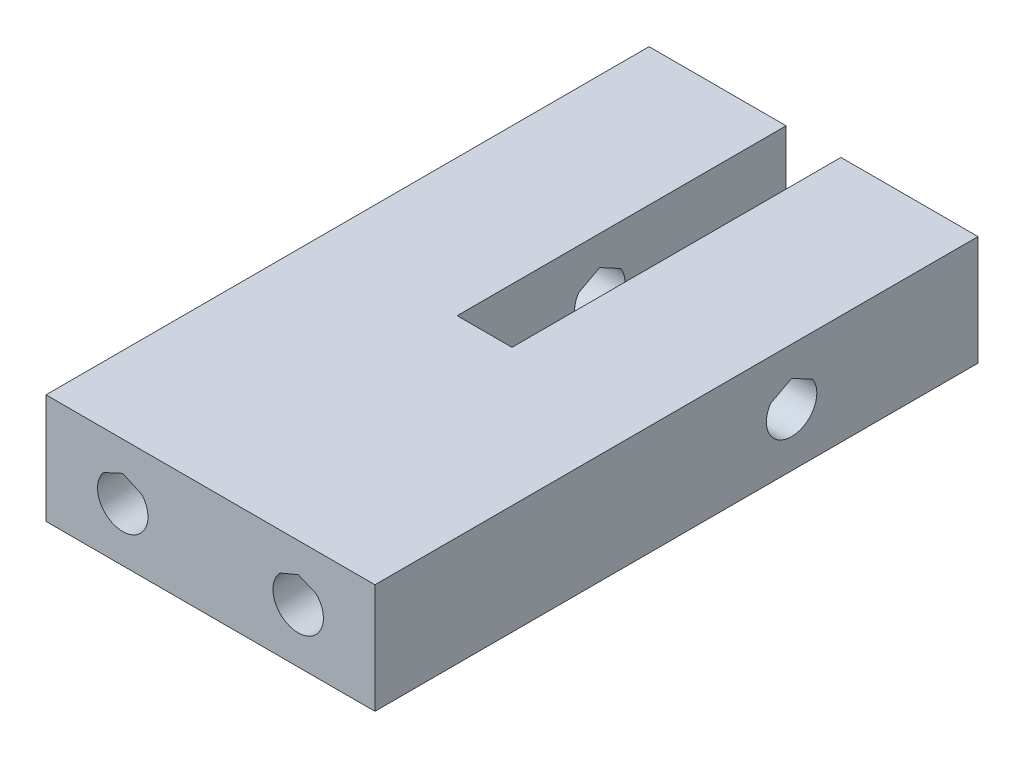
ISO-10303-21;
HEADER;
FILE_DESCRIPTION(('STEP AP214'),'2;1');
FILE_NAME('part.step','',(''),(''),'','','');
FILE_SCHEMA(('AUTOMOTIVE_DESIGN { 1 0 10303 214 1 1 1 1 }'));
ENDSEC;
DATA;
#1=APPLICATION_CONTEXT('core data for automotive mechanical design processes');
#2=APPLICATION_PROTOCOL_DEFINITION('international standard','automotive_design',2000,#1);
#3=PRODUCT_CONTEXT('',#1,'mechanical');
#4=PRODUCT('Part','Part','',(#3));
#5=PRODUCT_RELATED_PRODUCT_CATEGORY('part','',(#4));
#6=PRODUCT_DEFINITION_FORMATION('','',#4);
#7=PRODUCT_DEFINITION_CONTEXT('part definition',#1,'design');
#8=PRODUCT_DEFINITION('design','',#6,#7);
#9=PRODUCT_DEFINITION_SHAPE('','',#8);
#10=(LENGTH_UNIT() NAMED_UNIT(*) SI_UNIT(.MILLI.,.METRE.));
#11=(NAMED_UNIT(*) PLANE_ANGLE_UNIT() SI_UNIT($,.RADIAN.));
#12=(NAMED_UNIT(*) SI_UNIT($,.STERADIAN.) SOLID_ANGLE_UNIT());
#13=UNCERTAINTY_MEASURE_WITH_UNIT(LENGTH_MEASURE(1.E-05),#10,'distance_accuracy_value','');
#14=(GEOMETRIC_REPRESENTATION_CONTEXT(3) GLOBAL_UNCERTAINTY_ASSIGNED_CONTEXT((#13)) GLOBAL_UNIT_ASSIGNED_CONTEXT((#10,
#11,#12)) REPRESENTATION_CONTEXT('',''));
#15=CARTESIAN_POINT('',(0.,0.,0.));
#16=DIRECTION('',(0.,0.,1.));
#17=DIRECTION('',(1.,0.,0.));
#18=AXIS2_PLACEMENT_3D('',#15,#16,#17);
#19=CARTESIAN_POINT('',(-15.,10.,-27.5));
#20=DIRECTION('',(0.,0.,1.));
#21=DIRECTION('',(1.,0.,0.));
#22=AXIS2_PLACEMENT_3D('',#19,#20,#21);
#23=PLANE('',#22);
#24=DIRECTION('',(0.921369324591553,-0.388688265454085,0.));
#25=VECTOR('',#24,1.);
#26=CARTESIAN_POINT('',(8.,7.3,-27.5));
#27=LINE('',#26,#25);
#28=CARTESIAN_POINT('',(8.,7.3,-27.5));
#29=VERTEX_POINT('',#28);
#30=CARTESIAN_POINT('',(9.64737704524323,6.60503858857216,-27.5));
#31=VERTEX_POINT('',#30);
#32=EDGE_CURVE('E372',#29,#31,#27,.T.);
#33=ORIENTED_EDGE('',*,*,#32,.F.);
#34=DIRECTION('',(0.921369324591553,0.388688265454085,0.));
#35=VECTOR('',#34,1.);
#36=CARTESIAN_POINT('',(8.,7.3,-27.5));
#37=LINE('',#36,#35);
#38=CARTESIAN_POINT('',(6.35262295475678,6.60503858857216,-27.5));
#39=VERTEX_POINT('',#38);
#40=EDGE_CURVE('E358',#39,#29,#37,.T.);
#41=ORIENTED_EDGE('',*,*,#40,.F.);
#42=CARTESIAN_POINT('',(8.,5.,-27.5));
#43=DIRECTION('',(0.,0.,-1.));
#44=DIRECTION('',(-1.,0.,0.));
#45=AXIS2_PLACEMENT_3D('',#42,#43,#44);
#46=CIRCLE('',#45,2.3);
#47=EDGE_CURVE('E363',#31,#39,#46,.T.);
#48=ORIENTED_EDGE('',*,*,#47,.F.);
#49=EDGE_LOOP('',(#33,#41,#48));
#50=FACE_BOUND('',#49,.T.);
#51=DIRECTION('',(-1.,0.,0.));
#52=VECTOR('',#51,1.);
#53=CARTESIAN_POINT('',(-15.,0.,-27.5));
#54=LINE('',#53,#52);
#55=CARTESIAN_POINT('',(15.,0.,-27.5));
#56=VERTEX_POINT('',#55);
#57=CARTESIAN_POINT('',(2.5,0.,-27.5));
#58=VERTEX_POINT('',#57);
#59=EDGE_CURVE('E432',#56,#58,#54,.T.);
#60=ORIENTED_EDGE('',*,*,#59,.T.);
#61=DIRECTION('',(0.,-1.,0.));
#62=VECTOR('',#61,1.);
#63=CARTESIAN_POINT('',(2.5,10.,-27.5));
#64=LINE('',#63,#62);
#65=CARTESIAN_POINT('',(2.5,10.,-27.5));
#66=VERTEX_POINT('',#65);
#67=EDGE_CURVE('E261',#66,#58,#64,.T.);
#68=ORIENTED_EDGE('',*,*,#67,.F.);
#69=DIRECTION('',(-1.,0.,0.));
#70=VECTOR('',#69,1.);
#71=CARTESIAN_POINT('',(-15.,10.,-27.5));
#72=LINE('',#71,#70);
#73=CARTESIAN_POINT('',(15.,10.,-27.5));
#74=VERTEX_POINT('',#73);
#75=EDGE_CURVE('E252',#74,#66,#72,.T.);
#76=ORIENTED_EDGE('',*,*,#75,.F.);
#77=DIRECTION('',(0.,-1.,0.));
#78=VECTOR('',#77,1.);
#79=CARTESIAN_POINT('',(15.,10.,-27.5));
#80=LINE('',#79,#78);
#81=EDGE_CURVE('E446',#74,#56,#80,.T.);
#82=ORIENTED_EDGE('',*,*,#81,.T.);
#83=EDGE_LOOP('',(#60,#68,#76,#82));
#84=FACE_BOUND('',#83,.T.);
#85=ADVANCED_FACE('F35',(#50,#84),#23,.F.);
#86=CARTESIAN_POINT('',(-15.,5.,-10.5));
#87=DIRECTION('',(1.,0.,0.));
#88=DIRECTION('',(0.,0.,-1.));
#89=AXIS2_PLACEMENT_3D('',#86,#87,#88);
#90=CYLINDRICAL_SURFACE('',#89,2.3);
#91=DIRECTION('',(1.,0.,0.));
#92=VECTOR('',#91,1.);
#93=CARTESIAN_POINT('',(-15.,6.26948132665626,-12.4179200090909));
#94=LINE('',#93,#92);
#95=CARTESIAN_POINT('',(2.5,6.26948132665626,-12.4179200090909));
#96=VERTEX_POINT('',#95);
#97=CARTESIAN_POINT('',(6.08207999090914,6.26948132665626,-12.4179200090909));
#98=VERTEX_POINT('',#97);
#99=EDGE_CURVE('E306',#96,#98,#94,.T.);
#100=ORIENTED_EDGE('',*,*,#99,.F.);
#101=CARTESIAN_POINT('',(2.5,5.,-10.5));
#102=DIRECTION('',(1.,0.,0.));
#103=DIRECTION('',(0.,0.,-1.));
#104=AXIS2_PLACEMENT_3D('',#101,#102,#103);
#105=CIRCLE('',#104,2.3);
#106=CARTESIAN_POINT('',(2.5,6.26948132665626,-8.58207999090914));
#107=VERTEX_POINT('',#106);
#108=EDGE_CURVE('E274',#96,#107,#105,.F.);
#109=ORIENTED_EDGE('',*,*,#108,.T.);
#110=DIRECTION('',(1.,0.,0.));
#111=VECTOR('',#110,1.);
#112=CARTESIAN_POINT('',(-15.,6.26948132665626,-8.58207999090914));
#113=LINE('',#112,#111);
#114=CARTESIAN_POINT('',(6.08207999090914,6.26948132665626,-8.58207999090914));
#115=VERTEX_POINT('',#114);
#116=EDGE_CURVE('E312',#107,#115,#113,.T.);
#117=ORIENTED_EDGE('',*,*,#116,.T.);
#118=CARTESIAN_POINT('',(8.,5.,-10.5));
#119=DIRECTION('',(-0.707106781186547,0.,-0.707106781186547));
#120=DIRECTION('',(0.707106781186547,0.,-0.707106781186547));
#121=AXIS2_PLACEMENT_3D('',#118,#119,#120);
#122=ELLIPSE('',#121,3.25269119345812,2.3);
#123=CARTESIAN_POINT('',(8.,2.7,-10.5));
#124=VERTEX_POINT('',#123);
#125=EDGE_CURVE('E458',#124,#115,#122,.T.);
#126=ORIENTED_EDGE('',*,*,#125,.F.);
#127=CARTESIAN_POINT('',(8.,5.,-10.5));
#128=DIRECTION('',(0.707106781186547,0.,-0.707106781186547));
#129=DIRECTION('',(-0.707106781186547,0.,-0.707106781186547));
#130=AXIS2_PLACEMENT_3D('',#127,#128,#129);
#131=ELLIPSE('',#130,3.25269119345812,2.3);
#132=EDGE_CURVE('E464',#98,#124,#131,.F.);
#133=ORIENTED_EDGE('',*,*,#132,.F.);
#134=EDGE_LOOP('',(#100,#109,#117,#126,#133));
#135=FACE_BOUND('',#134,.T.);
#136=ADVANCED_FACE('F554',(#135),#90,.F.);
#137=CARTESIAN_POINT('',(-15.,7.3,-10.5));
#138=DIRECTION('',(0.,0.880893978550775,-0.473313636559298));
#139=DIRECTION('',(0.,0.473313636559298,0.880893978550775));
#140=AXIS2_PLACEMENT_3D('',#137,#138,#139);
#141=PLANE('',#140);
#142=DIRECTION('',(1.,0.,0.));
#143=VECTOR('',#142,1.);
#144=CARTESIAN_POINT('',(-15.,7.3,-10.5));
#145=LINE('',#144,#143);
#146=CARTESIAN_POINT('',(2.5,7.3,-10.5));
#147=VERTEX_POINT('',#146);
#148=CARTESIAN_POINT('',(8.,7.3,-10.5));
#149=VERTEX_POINT('',#148);
#150=EDGE_CURVE('E300',#147,#149,#145,.T.);
#151=ORIENTED_EDGE('',*,*,#150,.F.);
#152=DIRECTION('',(0.,-0.473313636559298,-0.880893978550775));
#153=VECTOR('',#152,1.);
#154=CARTESIAN_POINT('',(2.5,7.3,-10.5));
#155=LINE('',#154,#153);
#156=EDGE_CURVE('E271',#147,#96,#155,.T.);
#157=ORIENTED_EDGE('',*,*,#156,.T.);
#158=ORIENTED_EDGE('',*,*,#99,.T.);
#159=CARTESIAN_POINT('',(8.,5.,-14.7805784456053));
#160=DIRECTION('',(0.,0.880893978550775,-0.473313636559298));
#161=DIRECTION('',(0.,-0.473313636559298,-0.880893978550775));
#162=AXIS2_PLACEMENT_3D('',#159,#160,#161);
#163=ELLIPSE('',#162,4.85935714153431,2.3);
#164=CARTESIAN_POINT('',(6.35262295475678,6.60503858857216,-11.7934073209937));
#165=VERTEX_POINT('',#164);
#166=EDGE_CURVE('E316',#165,#98,#163,.F.);
#167=ORIENTED_EDGE('',*,*,#166,.F.);
#168=DIRECTION('',(-0.746518873852624,-0.314925967754726,-0.586115351970549));
#169=VECTOR('',#168,1.);
#170=CARTESIAN_POINT('',(24.6267545550299,14.3141518885386,2.55418582099128));
#171=LINE('',#170,#169);
#172=EDGE_CURVE('E315',#149,#165,#171,.T.);
#173=ORIENTED_EDGE('',*,*,#172,.F.);
#174=EDGE_LOOP('',(#151,#157,#158,#167,#173));
#175=FACE_BOUND('',#174,.T.);
#176=ADVANCED_FACE('F559',(#175),#141,.F.);
#177=CARTESIAN_POINT('',(-15.,7.3,-10.5));
#178=DIRECTION('',(0.,0.880893978550775,0.473313636559298));
#179=DIRECTION('',(0.,-0.473313636559298,0.880893978550775));
#180=AXIS2_PLACEMENT_3D('',#177,#178,#179);
#181=PLANE('',#180);
#182=ORIENTED_EDGE('',*,*,#116,.F.);
#183=DIRECTION('',(0.,0.473313636559298,-0.880893978550775));
#184=VECTOR('',#183,1.);
#185=CARTESIAN_POINT('',(2.5,7.3,-10.5));
#186=LINE('',#185,#184);
#187=EDGE_CURVE('E11',#107,#147,#186,.T.);
#188=ORIENTED_EDGE('',*,*,#187,.T.);
#189=ORIENTED_EDGE('',*,*,#150,.T.);
#190=DIRECTION('',(0.746518873852624,0.314925967754726,-0.586115351970549));
#191=VECTOR('',#190,1.);
#192=CARTESIAN_POINT('',(-8.62675455502995,0.285848111461384,2.55418582099128));
#193=LINE('',#192,#191);
#194=CARTESIAN_POINT('',(6.35262295475678,6.60503858857216,-9.20659267900633));
#195=VERTEX_POINT('',#194);
#196=EDGE_CURVE('E332',#195,#149,#193,.T.);
#197=ORIENTED_EDGE('',*,*,#196,.F.);
#198=CARTESIAN_POINT('',(8.,5.,-6.21942155439472));
#199=DIRECTION('',(0.,0.880893978550775,0.473313636559298));
#200=DIRECTION('',(0.,0.473313636559298,-0.880893978550775));
#201=AXIS2_PLACEMENT_3D('',#198,#199,#200);
#202=ELLIPSE('',#201,4.85935714153431,2.3);
#203=EDGE_CURVE('E333',#115,#195,#202,.F.);
#204=ORIENTED_EDGE('',*,*,#203,.F.);
#205=EDGE_LOOP('',(#182,#188,#189,#197,#204));
#206=FACE_BOUND('',#205,.T.);
#207=ADVANCED_FACE('F589',(#206),#181,.F.);
#208=CARTESIAN_POINT('',(-8.,7.3,27.5));
#209=DIRECTION('',(-0.42103123949319,0.907046137399211,0.));
#210=DIRECTION('',(-0.907046137399211,-0.42103123949319,0.));
#211=AXIS2_PLACEMENT_3D('',#208,#209,#210);
#212=PLANE('',#211);
#213=DIRECTION('',(0.,0.,-1.));
#214=VECTOR('',#213,1.);
#215=CARTESIAN_POINT('',(-9.75671589373082,6.48457039870581,27.5));
#216=LINE('',#215,#214);
#217=CARTESIAN_POINT('',(-9.75671589373082,6.48457039870581,27.5));
#218=VERTEX_POINT('',#217);
#219=CARTESIAN_POINT('',(-9.75671589373082,6.48457039870581,-8.98238679338764));
#220=VERTEX_POINT('',#219);
#221=EDGE_CURVE('E407',#218,#220,#216,.T.);
#222=ORIENTED_EDGE('',*,*,#221,.T.);
#223=DIRECTION('',(0.713963159051941,0.331406288405605,-0.616787223863947));
#224=VECTOR('',#223,1.);
#225=CARTESIAN_POINT('',(-24.7338074828856,-0.467472254676396,3.95620622182818));
#226=LINE('',#225,#224);
#227=CARTESIAN_POINT('',(-7.99999999999999,7.3,-10.5));
#228=VERTEX_POINT('',#227);
#229=EDGE_CURVE('E342',#220,#228,#226,.T.);
#230=ORIENTED_EDGE('',*,*,#229,.T.);
#231=DIRECTION('',(0.,0.,-1.));
#232=VECTOR('',#231,1.);
#233=CARTESIAN_POINT('',(-8.,7.3,27.5));
#234=LINE('',#233,#232);
#235=CARTESIAN_POINT('',(-8.,7.3,27.5));
#236=VERTEX_POINT('',#235);
#237=EDGE_CURVE('E416',#236,#228,#234,.T.);
#238=ORIENTED_EDGE('',*,*,#237,.F.);
#239=DIRECTION('',(0.907046137399211,0.42103123949319,0.));
#240=VECTOR('',#239,1.);
#241=CARTESIAN_POINT('',(-8.,7.3,27.5));
#242=LINE('',#241,#240);
#243=EDGE_CURVE('E389',#218,#236,#242,.T.);
#244=ORIENTED_EDGE('',*,*,#243,.F.);
#245=EDGE_LOOP('',(#222,#230,#238,#244));
#246=FACE_BOUND('',#245,.T.);
#247=ADVANCED_FACE('F512',(#246),#212,.F.);
#248=CARTESIAN_POINT('',(-8.,5.,27.5));
#249=DIRECTION('',(0.,0.,-1.));
#250=DIRECTION('',(-1.,0.,0.));
#251=AXIS2_PLACEMENT_3D('',#248,#249,#250);
#252=CYLINDRICAL_SURFACE('',#251,2.3);
#253=CARTESIAN_POINT('',(-9.75671589373082,6.48457039870581,-12.0176132066124));
#254=VERTEX_POINT('',#253);
#255=CARTESIAN_POINT('',(-9.75671589373082,6.48457039870581,-27.5));
#256=VERTEX_POINT('',#255);
#257=EDGE_CURVE('E411',#254,#256,#216,.T.);
#258=ORIENTED_EDGE('',*,*,#257,.F.);
#259=CARTESIAN_POINT('',(-8.,5.,-14.7805784456053));
#260=DIRECTION('',(0.,0.880893978550775,-0.473313636559298));
#261=DIRECTION('',(0.,-0.473313636559298,-0.880893978550775));
#262=AXIS2_PLACEMENT_3D('',#259,#260,#261);
#263=ELLIPSE('',#262,4.85935714153431,2.3);
#264=CARTESIAN_POINT('',(-9.91792000909085,6.26948132665626,-12.4179200090909));
#265=VERTEX_POINT('',#264);
#266=EDGE_CURVE('E326',#254,#265,#263,.F.);
#267=ORIENTED_EDGE('',*,*,#266,.T.);
#268=CARTESIAN_POINT('',(-8.,5.,-10.5));
#269=DIRECTION('',(0.707106781186547,0.,-0.707106781186547));
#270=DIRECTION('',(-0.707106781186547,0.,-0.707106781186547));
#271=AXIS2_PLACEMENT_3D('',#268,#269,#270);
#272=ELLIPSE('',#271,3.25269119345812,2.3);
#273=CARTESIAN_POINT('',(-8.,2.7,-10.5));
#274=VERTEX_POINT('',#273);
#275=EDGE_CURVE('E355',#265,#274,#272,.F.);
#276=ORIENTED_EDGE('',*,*,#275,.T.);
#277=CARTESIAN_POINT('',(-8.,5.,-10.5));
#278=DIRECTION('',(-0.707106781186547,0.,-0.707106781186547));
#279=DIRECTION('',(0.707106781186547,0.,-0.707106781186547));
#280=AXIS2_PLACEMENT_3D('',#277,#278,#279);
#281=ELLIPSE('',#280,3.25269119345812,2.3);
#282=CARTESIAN_POINT('',(-6.08207999090915,6.26948132665626,-12.4179200090909));
#283=VERTEX_POINT('',#282);
#284=EDGE_CURVE('E346',#274,#283,#281,.F.);
#285=ORIENTED_EDGE('',*,*,#284,.T.);
#286=CARTESIAN_POINT('',(-6.24328410626918,6.48457039870581,-12.0176132066124));
#287=VERTEX_POINT('',#286);
#288=EDGE_CURVE('E322',#283,#287,#263,.F.);
#289=ORIENTED_EDGE('',*,*,#288,.T.);
#290=DIRECTION('',(0.,0.,-1.));
#291=VECTOR('',#290,1.);
#292=CARTESIAN_POINT('',(-6.24328410626918,6.48457039870581,27.5));
#293=LINE('',#292,#291);
#294=CARTESIAN_POINT('',(-6.24328410626918,6.48457039870581,-27.5));
#295=VERTEX_POINT('',#294);
#296=EDGE_CURVE('E415',#287,#295,#293,.T.);
#297=ORIENTED_EDGE('',*,*,#296,.T.);
#298=CARTESIAN_POINT('',(-8.,5.,-27.5));
#299=DIRECTION('',(0.,0.,-1.));
#300=DIRECTION('',(-1.,0.,0.));
#301=AXIS2_PLACEMENT_3D('',#298,#299,#300);
#302=CIRCLE('',#301,2.3);
#303=EDGE_CURVE('E393',#295,#256,#302,.T.);
#304=ORIENTED_EDGE('',*,*,#303,.T.);
#305=EDGE_LOOP('',(#258,#267,#276,#285,#289,#297,#304));
#306=FACE_BOUND('',#305,.T.);
#307=ADVANCED_FACE('F498',(#306),#252,.F.);
#308=CARTESIAN_POINT('',(-8.,7.3,27.5));
#309=DIRECTION('',(0.42103123949319,0.907046137399211,0.));
#310=DIRECTION('',(-0.907046137399211,0.42103123949319,0.));
#311=AXIS2_PLACEMENT_3D('',#308,#309,#310);
#312=PLANE('',#311);
#313=ORIENTED_EDGE('',*,*,#237,.T.);
#314=DIRECTION('',(0.713963159051941,-0.331406288405605,0.616787223863947));
#315=VECTOR('',#314,1.);
#316=CARTESIAN_POINT('',(8.73380748288564,-0.467472254676396,3.95620622182818));
#317=LINE('',#316,#315);
#318=CARTESIAN_POINT('',(-6.24328410626918,6.48457039870581,-8.98238679338763));
#319=VERTEX_POINT('',#318);
#320=EDGE_CURVE('E336',#228,#319,#317,.T.);
#321=ORIENTED_EDGE('',*,*,#320,.T.);
#322=CARTESIAN_POINT('',(-6.24328410626918,6.48457039870581,27.5));
#323=VERTEX_POINT('',#322);
#324=EDGE_CURVE('E412',#323,#319,#293,.T.);
#325=ORIENTED_EDGE('',*,*,#324,.F.);
#326=DIRECTION('',(0.907046137399211,-0.42103123949319,0.));
#327=VECTOR('',#326,1.);
#328=CARTESIAN_POINT('',(-8.,7.3,27.5));
#329=LINE('',#328,#327);
#330=EDGE_CURVE('E392',#236,#323,#329,.T.);
#331=ORIENTED_EDGE('',*,*,#330,.F.);
#332=EDGE_LOOP('',(#313,#321,#325,#331));
#333=FACE_BOUND('',#332,.T.);
#334=ADVANCED_FACE('F508',(#333),#312,.F.);
#335=CARTESIAN_POINT('',(8.,7.3,27.5));
#336=DIRECTION('',(-0.388688265454085,0.921369324591553,0.));
#337=DIRECTION('',(-0.921369324591553,-0.388688265454085,0.));
#338=AXIS2_PLACEMENT_3D('',#335,#336,#337);
#339=PLANE('',#338);
#340=DIRECTION('',(0.,0.,-1.));
#341=VECTOR('',#340,1.);
#342=CARTESIAN_POINT('',(6.35262295475678,6.60503858857216,27.5));
#343=LINE('',#342,#341);
#344=CARTESIAN_POINT('',(6.35262295475678,6.60503858857216,27.5));
#345=VERTEX_POINT('',#344);
#346=EDGE_CURVE('E377',#345,#195,#343,.T.);
#347=ORIENTED_EDGE('',*,*,#346,.T.);
#348=ORIENTED_EDGE('',*,*,#196,.T.);
#349=DIRECTION('',(0.,0.,-1.));
#350=VECTOR('',#349,1.);
#351=CARTESIAN_POINT('',(8.,7.3,27.5));
#352=LINE('',#351,#350);
#353=CARTESIAN_POINT('',(8.,7.3,27.5));
#354=VERTEX_POINT('',#353);
#355=EDGE_CURVE('E386',#354,#149,#352,.T.);
#356=ORIENTED_EDGE('',*,*,#355,.F.);
#357=DIRECTION('',(0.921369324591553,0.388688265454085,0.));
#358=VECTOR('',#357,1.);
#359=CARTESIAN_POINT('',(8.,7.3,27.5));
#360=LINE('',#359,#358);
#361=EDGE_CURVE('E359',#345,#354,#360,.T.);
#362=ORIENTED_EDGE('',*,*,#361,.F.);
#363=EDGE_LOOP('',(#347,#348,#356,#362));
#364=FACE_BOUND('',#363,.T.);
#365=ADVANCED_FACE('F614',(#364),#339,.F.);
#366=CARTESIAN_POINT('',(8.,5.,27.5));
#367=DIRECTION('',(0.,0.,-1.));
#368=DIRECTION('',(-1.,0.,0.));
#369=AXIS2_PLACEMENT_3D('',#366,#367,#368);
#370=CYLINDRICAL_SURFACE('',#369,2.3);
#371=EDGE_CURVE('E381',#165,#39,#343,.T.);
#372=ORIENTED_EDGE('',*,*,#371,.F.);
#373=ORIENTED_EDGE('',*,*,#166,.T.);
#374=ORIENTED_EDGE('',*,*,#132,.T.);
#375=CARTESIAN_POINT('',(8.,5.,-10.5));
#376=DIRECTION('',(-0.707106781186547,0.,-0.707106781186547));
#377=DIRECTION('',(0.707106781186547,0.,-0.707106781186547));
#378=AXIS2_PLACEMENT_3D('',#375,#376,#377);
#379=ELLIPSE('',#378,3.25269119345812,2.3);
#380=CARTESIAN_POINT('',(9.91792000909085,6.26948132665626,-12.4179200090909));
#381=VERTEX_POINT('',#380);
#382=EDGE_CURVE('E455',#124,#381,#379,.F.);
#383=ORIENTED_EDGE('',*,*,#382,.T.);
#384=CARTESIAN_POINT('',(9.64737704524322,6.60503858857216,-11.7934073209937));
#385=VERTEX_POINT('',#384);
#386=EDGE_CURVE('E298',#381,#385,#163,.F.);
#387=ORIENTED_EDGE('',*,*,#386,.T.);
#388=DIRECTION('',(0.,0.,-1.));
#389=VECTOR('',#388,1.);
#390=CARTESIAN_POINT('',(9.64737704524323,6.60503858857216,27.5));
#391=LINE('',#390,#389);
#392=EDGE_CURVE('E385',#385,#31,#391,.T.);
#393=ORIENTED_EDGE('',*,*,#392,.T.);
#394=ORIENTED_EDGE('',*,*,#47,.T.);
#395=EDGE_LOOP('',(#372,#373,#374,#383,#387,#393,#394));
#396=FACE_BOUND('',#395,.T.);
#397=ADVANCED_FACE('F607',(#396),#370,.F.);
#398=CARTESIAN_POINT('',(8.,7.3,27.5));
#399=DIRECTION('',(0.388688265454085,0.921369324591553,0.));
#400=DIRECTION('',(-0.921369324591553,0.388688265454085,0.));
#401=AXIS2_PLACEMENT_3D('',#398,#399,#400);
#402=PLANE('',#401);
#403=ORIENTED_EDGE('',*,*,#355,.T.);
#404=DIRECTION('',(0.746518873852624,-0.314925967754726,0.586115351970548));
#405=VECTOR('',#404,1.);
#406=CARTESIAN_POINT('',(24.6267545550299,0.285848111461388,2.55418582099128));
#407=LINE('',#406,#405);
#408=CARTESIAN_POINT('',(9.64737704524322,6.60503858857216,-9.20659267900633));
#409=VERTEX_POINT('',#408);
#410=EDGE_CURVE('E452',#149,#409,#407,.T.);
#411=ORIENTED_EDGE('',*,*,#410,.T.);
#412=CARTESIAN_POINT('',(9.64737704524322,6.60503858857216,27.5));
#413=VERTEX_POINT('',#412);
#414=EDGE_CURVE('E382',#413,#409,#391,.T.);
#415=ORIENTED_EDGE('',*,*,#414,.F.);
#416=DIRECTION('',(0.921369324591553,-0.388688265454085,0.));
#417=VECTOR('',#416,1.);
#418=CARTESIAN_POINT('',(8.,7.3,27.5));
#419=LINE('',#418,#417);
#420=EDGE_CURVE('E362',#354,#413,#419,.T.);
#421=ORIENTED_EDGE('',*,*,#420,.F.);
#422=EDGE_LOOP('',(#403,#411,#415,#421));
#423=FACE_BOUND('',#422,.T.);
#424=ADVANCED_FACE('F572',(#423),#402,.F.);
#425=CARTESIAN_POINT('',(15.,10.,27.5));
#426=DIRECTION('',(-1.,0.,0.));
#427=DIRECTION('',(0.,0.,1.));
#428=AXIS2_PLACEMENT_3D('',#425,#426,#427);
#429=PLANE('',#428);
#430=CARTESIAN_POINT('',(15.,5.,-10.5));
#431=DIRECTION('',(1.,0.,0.));
#432=DIRECTION('',(0.,0.,-1.));
#433=AXIS2_PLACEMENT_3D('',#430,#431,#432);
#434=CIRCLE('',#433,2.3);
#435=CARTESIAN_POINT('',(15.,6.26948132665626,-8.58207999090914));
#436=VERTEX_POINT('',#435);
#437=CARTESIAN_POINT('',(15.,6.26948132665626,-12.4179200090909));
#438=VERTEX_POINT('',#437);
#439=EDGE_CURVE('E290',#436,#438,#434,.T.);
#440=ORIENTED_EDGE('',*,*,#439,.F.);
#441=DIRECTION('',(0.,-0.473313636559298,0.880893978550775));
#442=VECTOR('',#441,1.);
#443=CARTESIAN_POINT('',(15.,7.3,-10.5));
#444=LINE('',#443,#442);
#445=CARTESIAN_POINT('',(15.,7.3,-10.5));
#446=VERTEX_POINT('',#445);
#447=EDGE_CURVE('E277',#446,#436,#444,.T.);
#448=ORIENTED_EDGE('',*,*,#447,.F.);
#449=DIRECTION('',(0.,0.473313636559298,0.880893978550775));
#450=VECTOR('',#449,1.);
#451=CARTESIAN_POINT('',(15.,7.3,-10.5));
#452=LINE('',#451,#450);
#453=EDGE_CURVE('E282',#438,#446,#452,.T.);
#454=ORIENTED_EDGE('',*,*,#453,.F.);
#455=EDGE_LOOP('',(#440,#448,#454));
#456=FACE_BOUND('',#455,.T.);
#457=DIRECTION('',(0.,0.,-1.));
#458=VECTOR('',#457,1.);
#459=CARTESIAN_POINT('',(15.,0.,27.5));
#460=LINE('',#459,#458);
#461=CARTESIAN_POINT('',(15.,0.,27.5));
#462=VERTEX_POINT('',#461);
#463=EDGE_CURVE('E410',#462,#56,#460,.T.);
#464=ORIENTED_EDGE('',*,*,#463,.T.);
#465=ORIENTED_EDGE('',*,*,#81,.F.);
#466=DIRECTION('',(0.,0.,-1.));
#467=VECTOR('',#466,1.);
#468=CARTESIAN_POINT('',(15.,10.,27.5));
#469=LINE('',#468,#467);
#470=CARTESIAN_POINT('',(15.,10.,27.5));
#471=VERTEX_POINT('',#470);
#472=EDGE_CURVE('E419',#471,#74,#469,.T.);
#473=ORIENTED_EDGE('',*,*,#472,.F.);
#474=DIRECTION('',(0.,-1.,0.));
#475=VECTOR('',#474,1.);
#476=CARTESIAN_POINT('',(15.,10.,27.5));
#477=LINE('',#476,#475);
#478=EDGE_CURVE('E428',#471,#462,#477,.T.);
#479=ORIENTED_EDGE('',*,*,#478,.T.);
#480=EDGE_LOOP('',(#464,#465,#473,#479));
#481=FACE_BOUND('',#480,.T.);
#482=ADVANCED_FACE('F37',(#456,#481),#429,.F.);
#483=DIRECTION('',(0.907046137399211,-0.42103123949319,0.));
#484=VECTOR('',#483,1.);
#485=CARTESIAN_POINT('',(-8.,7.3,-27.5));
#486=LINE('',#485,#484);
#487=CARTESIAN_POINT('',(-8.,7.3,-27.5));
#488=VERTEX_POINT('',#487);
#489=EDGE_CURVE('E402',#488,#295,#486,.T.);
#490=ORIENTED_EDGE('',*,*,#489,.F.);
#491=DIRECTION('',(0.907046137399211,0.42103123949319,0.));
#492=VECTOR('',#491,1.);
#493=CARTESIAN_POINT('',(-8.,7.3,-27.5));
#494=LINE('',#493,#492);
#495=EDGE_CURVE('E380',#256,#488,#494,.T.);
#496=ORIENTED_EDGE('',*,*,#495,.F.);
#497=ORIENTED_EDGE('',*,*,#303,.F.);
#498=EDGE_LOOP('',(#490,#496,#497));
#499=FACE_BOUND('',#498,.T.);
#500=CARTESIAN_POINT('',(-2.5,10.,-27.5));
#501=VERTEX_POINT('',#500);
#502=CARTESIAN_POINT('',(-15.,10.,-27.5));
#503=VERTEX_POINT('',#502);
#504=EDGE_CURVE('E421',#501,#503,#72,.T.);
#505=ORIENTED_EDGE('',*,*,#504,.F.);
#506=DIRECTION('',(0.,-1.,0.));
#507=VECTOR('',#506,1.);
#508=CARTESIAN_POINT('',(-2.5,10.,-27.5));
#509=LINE('',#508,#507);
#510=CARTESIAN_POINT('',(-2.5,0.,-27.5));
#511=VERTEX_POINT('',#510);
#512=EDGE_CURVE('E264',#501,#511,#509,.T.);
#513=ORIENTED_EDGE('',*,*,#512,.T.);
#514=CARTESIAN_POINT('',(-15.,0.,-27.5));
#515=VERTEX_POINT('',#514);
#516=EDGE_CURVE('E431',#511,#515,#54,.T.);
#517=ORIENTED_EDGE('',*,*,#516,.T.);
#518=DIRECTION('',(0.,-1.,0.));
#519=VECTOR('',#518,1.);
#520=CARTESIAN_POINT('',(-15.,10.,-27.5));
#521=LINE('',#520,#519);
#522=EDGE_CURVE('E443',#503,#515,#521,.T.);
#523=ORIENTED_EDGE('',*,*,#522,.F.);
#524=EDGE_LOOP('',(#505,#513,#517,#523));
#525=FACE_BOUND('',#524,.T.);
#526=ADVANCED_FACE('F541',(#499,#525),#23,.F.);
#527=CARTESIAN_POINT('',(-15.,10.,27.5));
#528=DIRECTION('',(1.,0.,0.));
#529=DIRECTION('',(0.,0.,-1.));
#530=AXIS2_PLACEMENT_3D('',#527,#528,#529);
#531=PLANE('',#530);
#532=DIRECTION('',(0.,0.473313636559298,0.880893978550775));
#533=VECTOR('',#532,1.);
#534=CARTESIAN_POINT('',(-15.,7.3,-10.5));
#535=LINE('',#534,#533);
#536=CARTESIAN_POINT('',(-15.,6.26948132665626,-12.4179200090909));
#537=VERTEX_POINT('',#536);
#538=CARTESIAN_POINT('',(-15.,7.3,-10.5));
#539=VERTEX_POINT('',#538);
#540=EDGE_CURVE('E285',#537,#539,#535,.T.);
#541=ORIENTED_EDGE('',*,*,#540,.T.);
#542=DIRECTION('',(0.,-0.473313636559298,0.880893978550775));
#543=VECTOR('',#542,1.);
#544=CARTESIAN_POINT('',(-15.,7.3,-10.5));
#545=LINE('',#544,#543);
#546=CARTESIAN_POINT('',(-15.,6.26948132665626,-8.58207999090914));
#547=VERTEX_POINT('',#546);
#548=EDGE_CURVE('E278',#539,#547,#545,.T.);
#549=ORIENTED_EDGE('',*,*,#548,.T.);
#550=CARTESIAN_POINT('',(-15.,5.,-10.5));
#551=DIRECTION('',(1.,0.,0.));
#552=DIRECTION('',(0.,0.,-1.));
#553=AXIS2_PLACEMENT_3D('',#550,#551,#552);
#554=CIRCLE('',#553,2.3);
#555=EDGE_CURVE('E281',#547,#537,#554,.T.);
#556=ORIENTED_EDGE('',*,*,#555,.T.);
#557=EDGE_LOOP('',(#541,#549,#556));
#558=FACE_BOUND('',#557,.T.);
#559=DIRECTION('',(0.,0.,1.));
#560=VECTOR('',#559,1.);
#561=CARTESIAN_POINT('',(-15.,0.,27.5));
#562=LINE('',#561,#560);
#563=CARTESIAN_POINT('',(-15.,0.,27.5));
#564=VERTEX_POINT('',#563);
#565=EDGE_CURVE('E435',#515,#564,#562,.T.);
#566=ORIENTED_EDGE('',*,*,#565,.T.);
#567=DIRECTION('',(0.,-1.,0.));
#568=VECTOR('',#567,1.);
#569=CARTESIAN_POINT('',(-15.,10.,27.5));
#570=LINE('',#569,#568);
#571=CARTESIAN_POINT('',(-15.,10.,27.5));
#572=VERTEX_POINT('',#571);
#573=EDGE_CURVE('E440',#572,#564,#570,.T.);
#574=ORIENTED_EDGE('',*,*,#573,.F.);
#575=DIRECTION('',(0.,0.,1.));
#576=VECTOR('',#575,1.);
#577=CARTESIAN_POINT('',(-15.,10.,27.5));
#578=LINE('',#577,#576);
#579=EDGE_CURVE('E424',#503,#572,#578,.T.);
#580=ORIENTED_EDGE('',*,*,#579,.F.);
#581=ORIENTED_EDGE('',*,*,#522,.T.);
#582=EDGE_LOOP('',(#566,#574,#580,#581));
#583=FACE_BOUND('',#582,.T.);
#584=ADVANCED_FACE('F520',(#558,#583),#531,.F.);
#585=CARTESIAN_POINT('',(-15.,10.,27.5));
#586=DIRECTION('',(0.,0.,-1.));
#587=DIRECTION('',(-1.,0.,0.));
#588=AXIS2_PLACEMENT_3D('',#585,#586,#587);
#589=PLANE('',#588);
#590=CARTESIAN_POINT('',(8.,5.,27.5));
#591=DIRECTION('',(0.,0.,-1.));
#592=DIRECTION('',(-1.,0.,0.));
#593=AXIS2_PLACEMENT_3D('',#590,#591,#592);
#594=CIRCLE('',#593,2.3);
#595=EDGE_CURVE('E366',#413,#345,#594,.T.);
#596=ORIENTED_EDGE('',*,*,#595,.T.);
#597=ORIENTED_EDGE('',*,*,#361,.T.);
#598=ORIENTED_EDGE('',*,*,#420,.T.);
#599=EDGE_LOOP('',(#596,#597,#598));
#600=FACE_BOUND('',#599,.T.);
#601=CARTESIAN_POINT('',(-8.,5.,27.5));
#602=DIRECTION('',(0.,0.,-1.));
#603=DIRECTION('',(-1.,0.,0.));
#604=AXIS2_PLACEMENT_3D('',#601,#602,#603);
#605=CIRCLE('',#604,2.3);
#606=EDGE_CURVE('E396',#323,#218,#605,.T.);
#607=ORIENTED_EDGE('',*,*,#606,.T.);
#608=ORIENTED_EDGE('',*,*,#243,.T.);
#609=ORIENTED_EDGE('',*,*,#330,.T.);
#610=EDGE_LOOP('',(#607,#608,#609));
#611=FACE_BOUND('',#610,.T.);
#612=DIRECTION('',(1.,0.,0.));
#613=VECTOR('',#612,1.);
#614=CARTESIAN_POINT('',(-15.,0.,27.5));
#615=LINE('',#614,#613);
#616=EDGE_CURVE('E422',#564,#462,#615,.T.);
#617=ORIENTED_EDGE('',*,*,#616,.T.);
#618=ORIENTED_EDGE('',*,*,#478,.F.);
#619=DIRECTION('',(1.,0.,0.));
#620=VECTOR('',#619,1.);
#621=CARTESIAN_POINT('',(-15.,10.,27.5));
#622=LINE('',#621,#620);
#623=EDGE_CURVE('E426',#572,#471,#622,.T.);
#624=ORIENTED_EDGE('',*,*,#623,.F.);
#625=ORIENTED_EDGE('',*,*,#573,.T.);
#626=EDGE_LOOP('',(#617,#618,#624,#625));
#627=FACE_BOUND('',#626,.T.);
#628=ADVANCED_FACE('F517',(#600,#611,#627),#589,.F.);
#629=CARTESIAN_POINT('',(0.,10.,0.));
#630=DIRECTION('',(0.,-1.,0.));
#631=DIRECTION('',(0.,0.,-1.));
#632=AXIS2_PLACEMENT_3D('',#629,#630,#631);
#633=PLANE('',#632);
#634=ORIENTED_EDGE('',*,*,#75,.T.);
#635=DIRECTION('',(0.,0.,1.));
#636=VECTOR('',#635,1.);
#637=CARTESIAN_POINT('',(2.5,10.,-27.5));
#638=LINE('',#637,#636);
#639=CARTESIAN_POINT('',(2.5,10.,2.5));
#640=VERTEX_POINT('',#639);
#641=EDGE_CURVE('E234',#66,#640,#638,.T.);
#642=ORIENTED_EDGE('',*,*,#641,.T.);
#643=DIRECTION('',(-1.,0.,0.));
#644=VECTOR('',#643,1.);
#645=CARTESIAN_POINT('',(2.5,10.,2.5));
#646=LINE('',#645,#644);
#647=CARTESIAN_POINT('',(-2.5,10.,2.5));
#648=VERTEX_POINT('',#647);
#649=EDGE_CURVE('E243',#640,#648,#646,.T.);
#650=ORIENTED_EDGE('',*,*,#649,.T.);
#651=DIRECTION('',(0.,0.,-1.));
#652=VECTOR('',#651,1.);
#653=CARTESIAN_POINT('',(-2.5,10.,-27.5));
#654=LINE('',#653,#652);
#655=EDGE_CURVE('E240',#648,#501,#654,.T.);
#656=ORIENTED_EDGE('',*,*,#655,.T.);
#657=ORIENTED_EDGE('',*,*,#504,.T.);
#658=ORIENTED_EDGE('',*,*,#579,.T.);
#659=ORIENTED_EDGE('',*,*,#623,.T.);
#660=ORIENTED_EDGE('',*,*,#472,.T.);
#661=EDGE_LOOP('',(#634,#642,#650,#656,#657,#658,#659,#660));
#662=FACE_BOUND('',#661,.T.);
#663=ADVANCED_FACE('F250',(#662),#633,.F.);
#664=CARTESIAN_POINT('',(0.,0.,0.));
#665=DIRECTION('',(0.,-1.,0.));
#666=DIRECTION('',(0.,0.,-1.));
#667=AXIS2_PLACEMENT_3D('',#664,#665,#666);
#668=PLANE('',#667);
#669=DIRECTION('',(0.,0.,1.));
#670=VECTOR('',#669,1.);
#671=CARTESIAN_POINT('',(2.5,0.,-27.5));
#672=LINE('',#671,#670);
#673=CARTESIAN_POINT('',(2.5,0.,2.5));
#674=VERTEX_POINT('',#673);
#675=EDGE_CURVE('E50',#58,#674,#672,.T.);
#676=ORIENTED_EDGE('',*,*,#675,.F.);
#677=ORIENTED_EDGE('',*,*,#59,.F.);
#678=ORIENTED_EDGE('',*,*,#463,.F.);
#679=ORIENTED_EDGE('',*,*,#616,.F.);
#680=ORIENTED_EDGE('',*,*,#565,.F.);
#681=ORIENTED_EDGE('',*,*,#516,.F.);
#682=DIRECTION('',(0.,0.,-1.));
#683=VECTOR('',#682,1.);
#684=CARTESIAN_POINT('',(-2.5,0.,-27.5));
#685=LINE('',#684,#683);
#686=CARTESIAN_POINT('',(-2.5,0.,2.5));
#687=VERTEX_POINT('',#686);
#688=EDGE_CURVE('E253',#687,#511,#685,.T.);
#689=ORIENTED_EDGE('',*,*,#688,.F.);
#690=DIRECTION('',(-1.,0.,0.));
#691=VECTOR('',#690,1.);
#692=CARTESIAN_POINT('',(2.5,0.,2.5));
#693=LINE('',#692,#691);
#694=EDGE_CURVE('E255',#674,#687,#693,.T.);
#695=ORIENTED_EDGE('',*,*,#694,.F.);
#696=EDGE_LOOP('',(#676,#677,#678,#679,#680,#681,#689,#695));
#697=FACE_BOUND('',#696,.T.);
#698=ADVANCED_FACE('F532',(#697),#668,.T.);
#699=EDGE_CURVE('E399',#228,#488,#234,.T.);
#700=ORIENTED_EDGE('',*,*,#699,.F.);
#701=DIRECTION('',(-0.713963159051941,-0.331406288405605,-0.616787223863947));
#702=VECTOR('',#701,1.);
#703=CARTESIAN_POINT('',(8.73380748288564,15.0674722546764,3.95620622182818));
#704=LINE('',#703,#702);
#705=EDGE_CURVE('E325',#228,#254,#704,.T.);
#706=ORIENTED_EDGE('',*,*,#705,.T.);
#707=ORIENTED_EDGE('',*,*,#257,.T.);
#708=ORIENTED_EDGE('',*,*,#495,.T.);
#709=EDGE_LOOP('',(#700,#706,#707,#708));
#710=FACE_BOUND('',#709,.T.);
#711=ADVANCED_FACE('F580',(#710),#212,.F.);
#712=ORIENTED_EDGE('',*,*,#324,.T.);
#713=CARTESIAN_POINT('',(-8.,5.,-6.21942155439472));
#714=DIRECTION('',(0.,0.880893978550775,0.473313636559298));
#715=DIRECTION('',(0.,0.473313636559298,-0.880893978550775));
#716=AXIS2_PLACEMENT_3D('',#713,#714,#715);
#717=ELLIPSE('',#716,4.85935714153431,2.3);
#718=CARTESIAN_POINT('',(-6.08207999090915,6.26948132665626,-8.58207999090914));
#719=VERTEX_POINT('',#718);
#720=EDGE_CURVE('E339',#319,#719,#717,.F.);
#721=ORIENTED_EDGE('',*,*,#720,.T.);
#722=CARTESIAN_POINT('',(-8.,5.,-10.5));
#723=DIRECTION('',(0.707106781186547,0.,-0.707106781186547));
#724=DIRECTION('',(-0.707106781186547,0.,-0.707106781186547));
#725=AXIS2_PLACEMENT_3D('',#722,#723,#724);
#726=ELLIPSE('',#725,3.25269119345812,2.3);
#727=EDGE_CURVE('E352',#719,#274,#726,.T.);
#728=ORIENTED_EDGE('',*,*,#727,.T.);
#729=CARTESIAN_POINT('',(-8.,5.,-10.5));
#730=DIRECTION('',(-0.707106781186547,0.,-0.707106781186547));
#731=DIRECTION('',(0.707106781186547,0.,-0.707106781186547));
#732=AXIS2_PLACEMENT_3D('',#729,#730,#731);
#733=ELLIPSE('',#732,3.25269119345812,2.3);
#734=CARTESIAN_POINT('',(-9.91792000909085,6.26948132665626,-8.58207999090914));
#735=VERTEX_POINT('',#734);
#736=EDGE_CURVE('E349',#274,#735,#733,.T.);
#737=ORIENTED_EDGE('',*,*,#736,.T.);
#738=EDGE_CURVE('E343',#735,#220,#717,.F.);
#739=ORIENTED_EDGE('',*,*,#738,.T.);
#740=ORIENTED_EDGE('',*,*,#221,.F.);
#741=ORIENTED_EDGE('',*,*,#606,.F.);
#742=EDGE_LOOP('',(#712,#721,#728,#737,#739,#740,#741));
#743=FACE_BOUND('',#742,.T.);
#744=ADVANCED_FACE('F504',(#743),#252,.F.);
#745=ORIENTED_EDGE('',*,*,#296,.F.);
#746=DIRECTION('',(-0.713963159051941,0.331406288405605,0.616787223863947));
#747=VECTOR('',#746,1.);
#748=CARTESIAN_POINT('',(-24.7338074828856,15.0674722546764,3.95620622182818));
#749=LINE('',#748,#747);
#750=EDGE_CURVE('E319',#287,#228,#749,.T.);
#751=ORIENTED_EDGE('',*,*,#750,.T.);
#752=ORIENTED_EDGE('',*,*,#699,.T.);
#753=ORIENTED_EDGE('',*,*,#489,.T.);
#754=EDGE_LOOP('',(#745,#751,#752,#753));
#755=FACE_BOUND('',#754,.T.);
#756=ADVANCED_FACE('F577',(#755),#312,.F.);
#757=EDGE_CURVE('E369',#149,#29,#352,.T.);
#758=ORIENTED_EDGE('',*,*,#757,.F.);
#759=ORIENTED_EDGE('',*,*,#172,.T.);
#760=ORIENTED_EDGE('',*,*,#371,.T.);
#761=ORIENTED_EDGE('',*,*,#40,.T.);
#762=EDGE_LOOP('',(#758,#759,#760,#761));
#763=FACE_BOUND('',#762,.T.);
#764=ADVANCED_FACE('F605',(#763),#339,.F.);
#765=ORIENTED_EDGE('',*,*,#414,.T.);
#766=CARTESIAN_POINT('',(9.91792000909085,6.26948132665626,-8.58207999090914));
#767=VERTEX_POINT('',#766);
#768=EDGE_CURVE('E329',#409,#767,#202,.F.);
#769=ORIENTED_EDGE('',*,*,#768,.T.);
#770=CARTESIAN_POINT('',(8.,5.,-10.5));
#771=DIRECTION('',(0.707106781186547,0.,-0.707106781186547));
#772=DIRECTION('',(-0.707106781186547,0.,-0.707106781186547));
#773=AXIS2_PLACEMENT_3D('',#770,#771,#772);
#774=ELLIPSE('',#773,3.25269119345812,2.3);
#775=EDGE_CURVE('E461',#767,#124,#774,.T.);
#776=ORIENTED_EDGE('',*,*,#775,.T.);
#777=ORIENTED_EDGE('',*,*,#125,.T.);
#778=ORIENTED_EDGE('',*,*,#203,.T.);
#779=ORIENTED_EDGE('',*,*,#346,.F.);
#780=ORIENTED_EDGE('',*,*,#595,.F.);
#781=EDGE_LOOP('',(#765,#769,#776,#777,#778,#779,#780));
#782=FACE_BOUND('',#781,.T.);
#783=ADVANCED_FACE('F602',(#782),#370,.F.);
#784=ORIENTED_EDGE('',*,*,#392,.F.);
#785=DIRECTION('',(-0.746518873852624,0.314925967754726,0.586115351970548));
#786=VECTOR('',#785,1.);
#787=CARTESIAN_POINT('',(-8.62675455502995,14.3141518885386,2.55418582099128));
#788=LINE('',#787,#786);
#789=EDGE_CURVE('E449',#385,#149,#788,.T.);
#790=ORIENTED_EDGE('',*,*,#789,.T.);
#791=ORIENTED_EDGE('',*,*,#757,.T.);
#792=ORIENTED_EDGE('',*,*,#32,.T.);
#793=EDGE_LOOP('',(#784,#790,#791,#792));
#794=FACE_BOUND('',#793,.T.);
#795=ADVANCED_FACE('F600',(#794),#402,.F.);
#796=EDGE_CURVE('E310',#381,#438,#94,.T.);
#797=ORIENTED_EDGE('',*,*,#796,.T.);
#798=ORIENTED_EDGE('',*,*,#453,.T.);
#799=EDGE_CURVE('E304',#149,#446,#145,.T.);
#800=ORIENTED_EDGE('',*,*,#799,.F.);
#801=ORIENTED_EDGE('',*,*,#789,.F.);
#802=ORIENTED_EDGE('',*,*,#386,.F.);
#803=EDGE_LOOP('',(#797,#798,#800,#801,#802));
#804=FACE_BOUND('',#803,.T.);
#805=ADVANCED_FACE('F492',(#804),#141,.F.);
#806=ORIENTED_EDGE('',*,*,#410,.F.);
#807=ORIENTED_EDGE('',*,*,#799,.T.);
#808=ORIENTED_EDGE('',*,*,#447,.T.);
#809=EDGE_CURVE('E288',#767,#436,#113,.T.);
#810=ORIENTED_EDGE('',*,*,#809,.F.);
#811=ORIENTED_EDGE('',*,*,#768,.F.);
#812=EDGE_LOOP('',(#806,#807,#808,#810,#811));
#813=FACE_BOUND('',#812,.T.);
#814=ADVANCED_FACE('F590',(#813),#181,.F.);
#815=ORIENTED_EDGE('',*,*,#809,.T.);
#816=ORIENTED_EDGE('',*,*,#439,.T.);
#817=ORIENTED_EDGE('',*,*,#796,.F.);
#818=ORIENTED_EDGE('',*,*,#382,.F.);
#819=ORIENTED_EDGE('',*,*,#775,.F.);
#820=EDGE_LOOP('',(#815,#816,#817,#818,#819));
#821=FACE_BOUND('',#820,.T.);
#822=ADVANCED_FACE('F482',(#821),#90,.F.);
#823=CARTESIAN_POINT('',(-2.5,6.26948132665626,-8.58207999090914));
#824=VERTEX_POINT('',#823);
#825=EDGE_CURVE('E311',#719,#824,#113,.T.);
#826=ORIENTED_EDGE('',*,*,#825,.T.);
#827=CARTESIAN_POINT('',(-2.5,5.,-10.5));
#828=DIRECTION('',(-1.,0.,0.));
#829=DIRECTION('',(0.,0.,1.));
#830=AXIS2_PLACEMENT_3D('',#827,#828,#829);
#831=CIRCLE('',#830,2.3);
#832=CARTESIAN_POINT('',(-2.5,6.26948132665626,-12.4179200090909));
#833=VERTEX_POINT('',#832);
#834=EDGE_CURVE('E58',#824,#833,#831,.F.);
#835=ORIENTED_EDGE('',*,*,#834,.T.);
#836=EDGE_CURVE('E305',#283,#833,#94,.T.);
#837=ORIENTED_EDGE('',*,*,#836,.F.);
#838=ORIENTED_EDGE('',*,*,#284,.F.);
#839=ORIENTED_EDGE('',*,*,#727,.F.);
#840=EDGE_LOOP('',(#826,#835,#837,#838,#839));
#841=FACE_BOUND('',#840,.T.);
#842=ADVANCED_FACE('F474',(#841),#90,.F.);
#843=ORIENTED_EDGE('',*,*,#836,.T.);
#844=DIRECTION('',(0.,0.473313636559298,0.880893978550775));
#845=VECTOR('',#844,1.);
#846=CARTESIAN_POINT('',(-2.5,7.3,-10.5));
#847=LINE('',#846,#845);
#848=CARTESIAN_POINT('',(-2.5,7.3,-10.5));
#849=VERTEX_POINT('',#848);
#850=EDGE_CURVE('E263',#833,#849,#847,.T.);
#851=ORIENTED_EDGE('',*,*,#850,.T.);
#852=EDGE_CURVE('E299',#228,#849,#145,.T.);
#853=ORIENTED_EDGE('',*,*,#852,.F.);
#854=ORIENTED_EDGE('',*,*,#750,.F.);
#855=ORIENTED_EDGE('',*,*,#288,.F.);
#856=EDGE_LOOP('',(#843,#851,#853,#854,#855));
#857=FACE_BOUND('',#856,.T.);
#858=ADVANCED_FACE('F495',(#857),#141,.F.);
#859=ORIENTED_EDGE('',*,*,#852,.T.);
#860=DIRECTION('',(0.,-0.473313636559298,0.880893978550775));
#861=VECTOR('',#860,1.);
#862=CARTESIAN_POINT('',(-2.5,7.3,-10.5));
#863=LINE('',#862,#861);
#864=EDGE_CURVE('E43',#849,#824,#863,.T.);
#865=ORIENTED_EDGE('',*,*,#864,.T.);
#866=ORIENTED_EDGE('',*,*,#825,.F.);
#867=ORIENTED_EDGE('',*,*,#720,.F.);
#868=ORIENTED_EDGE('',*,*,#320,.F.);
#869=EDGE_LOOP('',(#859,#865,#866,#867,#868));
#870=FACE_BOUND('',#869,.T.);
#871=ADVANCED_FACE('F470',(#870),#181,.F.);
#872=EDGE_CURVE('E301',#537,#265,#94,.T.);
#873=ORIENTED_EDGE('',*,*,#872,.F.);
#874=ORIENTED_EDGE('',*,*,#555,.F.);
#875=EDGE_CURVE('E307',#547,#735,#113,.T.);
#876=ORIENTED_EDGE('',*,*,#875,.T.);
#877=ORIENTED_EDGE('',*,*,#736,.F.);
#878=ORIENTED_EDGE('',*,*,#275,.F.);
#879=EDGE_LOOP('',(#873,#874,#876,#877,#878));
#880=FACE_BOUND('',#879,.T.);
#881=ADVANCED_FACE('F562',(#880),#90,.F.);
#882=ORIENTED_EDGE('',*,*,#875,.F.);
#883=ORIENTED_EDGE('',*,*,#548,.F.);
#884=EDGE_CURVE('E295',#539,#228,#145,.T.);
#885=ORIENTED_EDGE('',*,*,#884,.T.);
#886=ORIENTED_EDGE('',*,*,#229,.F.);
#887=ORIENTED_EDGE('',*,*,#738,.F.);
#888=EDGE_LOOP('',(#882,#883,#885,#886,#887));
#889=FACE_BOUND('',#888,.T.);
#890=ADVANCED_FACE('F514',(#889),#181,.F.);
#891=ORIENTED_EDGE('',*,*,#705,.F.);
#892=ORIENTED_EDGE('',*,*,#884,.F.);
#893=ORIENTED_EDGE('',*,*,#540,.F.);
#894=ORIENTED_EDGE('',*,*,#872,.T.);
#895=ORIENTED_EDGE('',*,*,#266,.F.);
#896=EDGE_LOOP('',(#891,#892,#893,#894,#895));
#897=FACE_BOUND('',#896,.T.);
#898=ADVANCED_FACE('F551',(#897),#141,.F.);
#899=CARTESIAN_POINT('',(2.5,10.,-27.5));
#900=DIRECTION('',(1.,0.,0.));
#901=DIRECTION('',(0.,0.,-1.));
#902=AXIS2_PLACEMENT_3D('',#899,#900,#901);
#903=PLANE('',#902);
#904=ORIENTED_EDGE('',*,*,#675,.T.);
#905=DIRECTION('',(0.,-1.,0.));
#906=VECTOR('',#905,1.);
#907=CARTESIAN_POINT('',(2.5,10.,2.5));
#908=LINE('',#907,#906);
#909=EDGE_CURVE('E229',#640,#674,#908,.T.);
#910=ORIENTED_EDGE('',*,*,#909,.F.);
#911=ORIENTED_EDGE('',*,*,#641,.F.);
#912=ORIENTED_EDGE('',*,*,#67,.T.);
#913=EDGE_LOOP('',(#904,#910,#911,#912));
#914=FACE_BOUND('',#913,.T.);
#915=ORIENTED_EDGE('',*,*,#156,.F.);
#916=ORIENTED_EDGE('',*,*,#187,.F.);
#917=ORIENTED_EDGE('',*,*,#108,.F.);
#918=EDGE_LOOP('',(#915,#916,#917));
#919=FACE_BOUND('',#918,.T.);
#920=ADVANCED_FACE('F231',(#914,#919),#903,.F.);
#921=CARTESIAN_POINT('',(-2.5,10.,-27.5));
#922=DIRECTION('',(-1.,0.,0.));
#923=DIRECTION('',(0.,0.,1.));
#924=AXIS2_PLACEMENT_3D('',#921,#922,#923);
#925=PLANE('',#924);
#926=ORIENTED_EDGE('',*,*,#688,.T.);
#927=ORIENTED_EDGE('',*,*,#512,.F.);
#928=ORIENTED_EDGE('',*,*,#655,.F.);
#929=DIRECTION('',(0.,-1.,0.));
#930=VECTOR('',#929,1.);
#931=CARTESIAN_POINT('',(-2.5,10.,2.5));
#932=LINE('',#931,#930);
#933=EDGE_CURVE('E239',#648,#687,#932,.T.);
#934=ORIENTED_EDGE('',*,*,#933,.T.);
#935=EDGE_LOOP('',(#926,#927,#928,#934));
#936=FACE_BOUND('',#935,.T.);
#937=ORIENTED_EDGE('',*,*,#864,.F.);
#938=ORIENTED_EDGE('',*,*,#850,.F.);
#939=ORIENTED_EDGE('',*,*,#834,.F.);
#940=EDGE_LOOP('',(#937,#938,#939));
#941=FACE_BOUND('',#940,.T.);
#942=ADVANCED_FACE('F543',(#936,#941),#925,.F.);
#943=CARTESIAN_POINT('',(2.5,10.,2.5));
#944=DIRECTION('',(0.,0.,1.));
#945=DIRECTION('',(1.,0.,0.));
#946=AXIS2_PLACEMENT_3D('',#943,#944,#945);
#947=PLANE('',#946);
#948=ORIENTED_EDGE('',*,*,#694,.T.);
#949=ORIENTED_EDGE('',*,*,#933,.F.);
#950=ORIENTED_EDGE('',*,*,#649,.F.);
#951=ORIENTED_EDGE('',*,*,#909,.T.);
#952=EDGE_LOOP('',(#948,#949,#950,#951));
#953=FACE_BOUND('',#952,.T.);
#954=ADVANCED_FACE('F244',(#953),#947,.F.);
#955=CLOSED_SHELL('',(#85,#136,#176,#207,#247,#307,#334,#365,#397,#424,#482,#526,#584,#628,#663,
#698,#711,#744,#756,#764,#783,#795,#805,#814,#822,#842,#858,#871,#881,#890,#898,#920,#942,#954));
#956=MANIFOLD_SOLID_BREP('B2',#955);
#957=ADVANCED_BREP_SHAPE_REPRESENTATION('',(#18,#956),#14);
#958=SHAPE_DEFINITION_REPRESENTATION(#9,#957);
ENDSEC;
END-ISO-10303-21;
